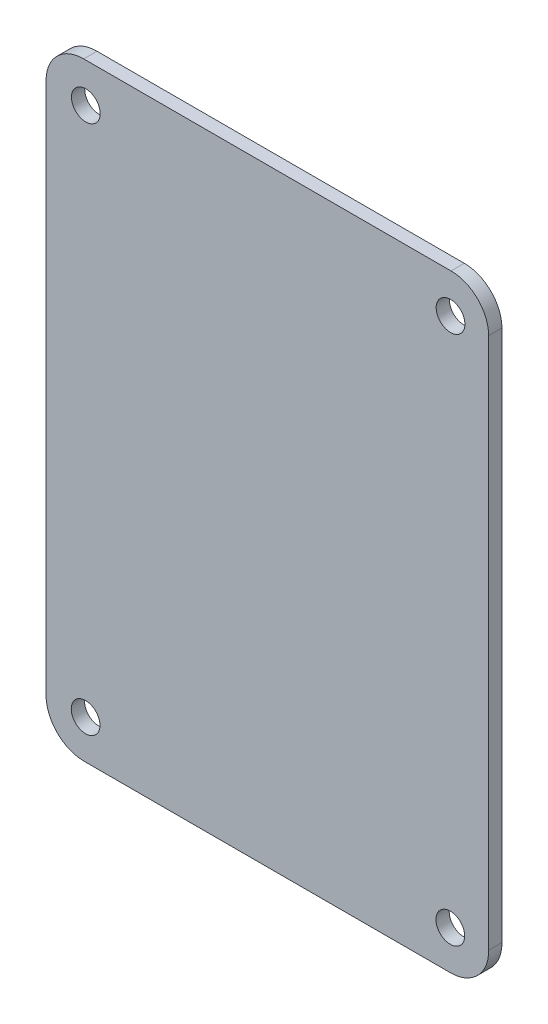
ISO-10303-21;
HEADER;
FILE_DESCRIPTION(('STEP AP214'),'2;1');
FILE_NAME('part.step','',(''),(''),'','','');
FILE_SCHEMA(('AUTOMOTIVE_DESIGN { 1 0 10303 214 1 1 1 1 }'));
ENDSEC;
DATA;
#1=APPLICATION_CONTEXT('core data for automotive mechanical design processes');
#2=APPLICATION_PROTOCOL_DEFINITION('international standard','automotive_design',2000,#1);
#3=PRODUCT_CONTEXT('',#1,'mechanical');
#4=PRODUCT('Part','Part','',(#3));
#5=PRODUCT_RELATED_PRODUCT_CATEGORY('part','',(#4));
#6=PRODUCT_DEFINITION_FORMATION('','',#4);
#7=PRODUCT_DEFINITION_CONTEXT('part definition',#1,'design');
#8=PRODUCT_DEFINITION('design','',#6,#7);
#9=PRODUCT_DEFINITION_SHAPE('','',#8);
#10=(LENGTH_UNIT() NAMED_UNIT(*) SI_UNIT(.MILLI.,.METRE.));
#11=(NAMED_UNIT(*) PLANE_ANGLE_UNIT() SI_UNIT($,.RADIAN.));
#12=(NAMED_UNIT(*) SI_UNIT($,.STERADIAN.) SOLID_ANGLE_UNIT());
#13=UNCERTAINTY_MEASURE_WITH_UNIT(LENGTH_MEASURE(1.E-05),#10,'distance_accuracy_value','');
#14=(GEOMETRIC_REPRESENTATION_CONTEXT(3) GLOBAL_UNCERTAINTY_ASSIGNED_CONTEXT((#13)) GLOBAL_UNIT_ASSIGNED_CONTEXT((#10,
#11,#12)) REPRESENTATION_CONTEXT('',''));
#15=CARTESIAN_POINT('',(0.,0.,0.));
#16=DIRECTION('',(0.,0.,1.));
#17=DIRECTION('',(1.,0.,0.));
#18=AXIS2_PLACEMENT_3D('',#15,#16,#17);
#19=CARTESIAN_POINT('',(-0.08252,-0.02399977056487,-1.2));
#20=DIRECTION('',(0.,0.,1.));
#21=DIRECTION('',(1.,0.,0.));
#22=AXIS2_PLACEMENT_3D('',#19,#20,#21);
#23=PLANE('',#22);
#24=CARTESIAN_POINT('',(16.491277,23.930743,-1.2));
#25=DIRECTION('',(0.,0.,1.));
#26=DIRECTION('',(1.,0.,0.));
#27=AXIS2_PLACEMENT_3D('',#24,#25,#26);
#28=CIRCLE('',#27,1.3);
#29=CARTESIAN_POINT('',(15.191277,23.930743,-1.2));
#30=VERTEX_POINT('',#29);
#31=EDGE_CURVE('E221',#30,#30,#28,.T.);
#32=ORIENTED_EDGE('',*,*,#31,.T.);
#33=EDGE_LOOP('',(#32));
#34=FACE_BOUND('',#33,.T.);
#35=CARTESIAN_POINT('',(-16.508723,23.930743,-1.2));
#36=DIRECTION('',(0.,0.,1.));
#37=DIRECTION('',(1.,0.,0.));
#38=AXIS2_PLACEMENT_3D('',#35,#36,#37);
#39=CIRCLE('',#38,1.3);
#40=CARTESIAN_POINT('',(-17.808723,23.930743,-1.2));
#41=VERTEX_POINT('',#40);
#42=EDGE_CURVE('E149',#41,#41,#39,.T.);
#43=ORIENTED_EDGE('',*,*,#42,.T.);
#44=EDGE_LOOP('',(#43));
#45=FACE_BOUND('',#44,.T.);
#46=CARTESIAN_POINT('',(16.471277,-24.019257,-1.2));
#47=DIRECTION('',(0.,0.,1.));
#48=DIRECTION('',(1.,0.,0.));
#49=AXIS2_PLACEMENT_3D('',#46,#47,#48);
#50=CIRCLE('',#49,1.3);
#51=CARTESIAN_POINT('',(15.171277,-24.019257,-1.2));
#52=VERTEX_POINT('',#51);
#53=EDGE_CURVE('E158',#52,#52,#50,.T.);
#54=ORIENTED_EDGE('',*,*,#53,.T.);
#55=EDGE_LOOP('',(#54));
#56=FACE_BOUND('',#55,.T.);
#57=CARTESIAN_POINT('',(-16.528723,-24.019257,-1.2));
#58=DIRECTION('',(0.,0.,1.));
#59=DIRECTION('',(1.,0.,0.));
#60=AXIS2_PLACEMENT_3D('',#57,#58,#59);
#61=CIRCLE('',#60,1.3);
#62=CARTESIAN_POINT('',(-17.828723,-24.019257,-1.2));
#63=VERTEX_POINT('',#62);
#64=EDGE_CURVE('E20',#63,#63,#61,.T.);
#65=ORIENTED_EDGE('',*,*,#64,.T.);
#66=EDGE_LOOP('',(#65));
#67=FACE_BOUND('',#66,.T.);
#68=DIRECTION('',(0.,-1.,0.));
#69=VECTOR('',#68,1.);
#70=CARTESIAN_POINT('',(-20.10752,24.11146,-1.2));
#71=LINE('',#70,#69);
#72=CARTESIAN_POINT('',(-20.10752,24.11146,-1.2));
#73=VERTEX_POINT('',#72);
#74=CARTESIAN_POINT('',(-20.10752,-24.05137,-1.2));
#75=VERTEX_POINT('',#74);
#76=EDGE_CURVE('E176',#73,#75,#71,.T.);
#77=ORIENTED_EDGE('',*,*,#76,.F.);
#78=CARTESIAN_POINT('',(-16.71963,24.09009,-1.2));
#79=DIRECTION('',(0.,0.,1.));
#80=DIRECTION('',(0.00630763539534392,0.999980106669987,0.));
#81=AXIS2_PLACEMENT_3D('',#78,#79,#80);
#82=CIRCLE('',#81,3.387957397755);
#83=CARTESIAN_POINT('',(-16.69826,27.47798,-1.2));
#84=VERTEX_POINT('',#83);
#85=EDGE_CURVE('E170',#84,#73,#82,.T.);
#86=ORIENTED_EDGE('',*,*,#85,.F.);
#87=DIRECTION('',(-1.,0.,0.));
#88=VECTOR('',#87,1.);
#89=CARTESIAN_POINT('',(16.53322,27.47798,-1.2));
#90=LINE('',#89,#88);
#91=CARTESIAN_POINT('',(16.53322,27.47798,-1.2));
#92=VERTEX_POINT('',#91);
#93=EDGE_CURVE('E164',#92,#84,#90,.T.);
#94=ORIENTED_EDGE('',*,*,#93,.F.);
#95=CARTESIAN_POINT('',(16.55459,24.09009,-1.2));
#96=DIRECTION('',(0.,0.,1.));
#97=DIRECTION('',(0.999980106669987,0.00630763539534692,0.));
#98=AXIS2_PLACEMENT_3D('',#95,#96,#97);
#99=CIRCLE('',#98,3.387957397755);
#100=CARTESIAN_POINT('',(19.94248,24.11146,-1.2));
#101=VERTEX_POINT('',#100);
#102=EDGE_CURVE('E207',#101,#92,#99,.T.);
#103=ORIENTED_EDGE('',*,*,#102,.F.);
#104=DIRECTION('',(0.,1.,0.));
#105=VECTOR('',#104,1.);
#106=CARTESIAN_POINT('',(19.94248,-24.05137,-1.2));
#107=LINE('',#106,#105);
#108=CARTESIAN_POINT('',(19.94248,-24.05137,-1.2));
#109=VERTEX_POINT('',#108);
#110=EDGE_CURVE('E185',#109,#101,#107,.T.);
#111=ORIENTED_EDGE('',*,*,#110,.F.);
#112=CARTESIAN_POINT('',(16.49193,-24.09266,-1.2));
#113=DIRECTION('',(0.,0.,1.));
#114=DIRECTION('',(0.0119653516561059,-0.999928412617496,0.));
#115=AXIS2_PLACEMENT_3D('',#112,#113,#114);
#116=CIRCLE('',#115,3.450797033527);
#117=CARTESIAN_POINT('',(16.53322,-27.54321,-1.2));
#118=VERTEX_POINT('',#117);
#119=EDGE_CURVE('E240',#118,#109,#116,.T.);
#120=ORIENTED_EDGE('',*,*,#119,.F.);
#121=DIRECTION('',(1.,0.,0.));
#122=VECTOR('',#121,1.);
#123=CARTESIAN_POINT('',(-16.69826,-27.54321,-1.2));
#124=LINE('',#123,#122);
#125=CARTESIAN_POINT('',(-16.69826,-27.54321,-1.2));
#126=VERTEX_POINT('',#125);
#127=EDGE_CURVE('E112',#126,#118,#124,.T.);
#128=ORIENTED_EDGE('',*,*,#127,.F.);
#129=CARTESIAN_POINT('',(-16.65697,-24.09266,-1.2));
#130=DIRECTION('',(0.,0.,1.));
#131=DIRECTION('',(-0.999928412617496,0.0119653516561159,0.));
#132=AXIS2_PLACEMENT_3D('',#129,#130,#131);
#133=CIRCLE('',#132,3.450797033527);
#134=EDGE_CURVE('E169',#75,#126,#133,.T.);
#135=ORIENTED_EDGE('',*,*,#134,.F.);
#136=EDGE_LOOP('',(#77,#86,#94,#103,#111,#120,#128,#135));
#137=FACE_BOUND('',#136,.T.);
#138=ADVANCED_FACE('F16',(#34,#45,#56,#67,#137),#23,.F.);
#139=CARTESIAN_POINT('',(-0.08252,-0.02399977056487,0.));
#140=DIRECTION('',(0.,0.,1.));
#141=DIRECTION('',(1.,0.,0.));
#142=AXIS2_PLACEMENT_3D('',#139,#140,#141);
#143=PLANE('',#142);
#144=CARTESIAN_POINT('',(16.491277,23.930743,0.));
#145=DIRECTION('',(0.,0.,1.));
#146=DIRECTION('',(1.,0.,0.));
#147=AXIS2_PLACEMENT_3D('',#144,#145,#146);
#148=CIRCLE('',#147,1.3);
#149=CARTESIAN_POINT('',(15.191277,23.930743,0.));
#150=VERTEX_POINT('',#149);
#151=EDGE_CURVE('E11',#150,#150,#148,.T.);
#152=ORIENTED_EDGE('',*,*,#151,.F.);
#153=EDGE_LOOP('',(#152));
#154=FACE_BOUND('',#153,.T.);
#155=CARTESIAN_POINT('',(-16.508723,23.930743,0.));
#156=DIRECTION('',(0.,0.,1.));
#157=DIRECTION('',(1.,0.,0.));
#158=AXIS2_PLACEMENT_3D('',#155,#156,#157);
#159=CIRCLE('',#158,1.3);
#160=CARTESIAN_POINT('',(-17.808723,23.930743,0.));
#161=VERTEX_POINT('',#160);
#162=EDGE_CURVE('E218',#161,#161,#159,.T.);
#163=ORIENTED_EDGE('',*,*,#162,.F.);
#164=EDGE_LOOP('',(#163));
#165=FACE_BOUND('',#164,.T.);
#166=CARTESIAN_POINT('',(16.471277,-24.019257,0.));
#167=DIRECTION('',(0.,0.,1.));
#168=DIRECTION('',(1.,0.,0.));
#169=AXIS2_PLACEMENT_3D('',#166,#167,#168);
#170=CIRCLE('',#169,1.3);
#171=CARTESIAN_POINT('',(15.171277,-24.019257,0.));
#172=VERTEX_POINT('',#171);
#173=EDGE_CURVE('E145',#172,#172,#170,.T.);
#174=ORIENTED_EDGE('',*,*,#173,.F.);
#175=EDGE_LOOP('',(#174));
#176=FACE_BOUND('',#175,.T.);
#177=CARTESIAN_POINT('',(-16.528723,-24.019257,0.));
#178=DIRECTION('',(0.,0.,1.));
#179=DIRECTION('',(1.,0.,0.));
#180=AXIS2_PLACEMENT_3D('',#177,#178,#179);
#181=CIRCLE('',#180,1.3);
#182=CARTESIAN_POINT('',(-17.828723,-24.019257,0.));
#183=VERTEX_POINT('',#182);
#184=EDGE_CURVE('E181',#183,#183,#181,.T.);
#185=ORIENTED_EDGE('',*,*,#184,.F.);
#186=EDGE_LOOP('',(#185));
#187=FACE_BOUND('',#186,.T.);
#188=DIRECTION('',(0.,-1.,0.));
#189=VECTOR('',#188,1.);
#190=CARTESIAN_POINT('',(-20.10752,24.11146,0.));
#191=LINE('',#190,#189);
#192=CARTESIAN_POINT('',(-20.10752,24.11146,0.));
#193=VERTEX_POINT('',#192);
#194=CARTESIAN_POINT('',(-20.10752,-24.05137,0.));
#195=VERTEX_POINT('',#194);
#196=EDGE_CURVE('E175',#193,#195,#191,.T.);
#197=ORIENTED_EDGE('',*,*,#196,.T.);
#198=CARTESIAN_POINT('',(-16.65697,-24.09266,0.));
#199=DIRECTION('',(0.,0.,1.));
#200=DIRECTION('',(-0.999928412617496,0.0119653516561159,0.));
#201=AXIS2_PLACEMENT_3D('',#198,#199,#200);
#202=CIRCLE('',#201,3.450797033527);
#203=CARTESIAN_POINT('',(-16.69826,-27.54321,0.));
#204=VERTEX_POINT('',#203);
#205=EDGE_CURVE('E165',#195,#204,#202,.T.);
#206=ORIENTED_EDGE('',*,*,#205,.T.);
#207=DIRECTION('',(1.,0.,0.));
#208=VECTOR('',#207,1.);
#209=CARTESIAN_POINT('',(-16.69826,-27.54321,0.));
#210=LINE('',#209,#208);
#211=CARTESIAN_POINT('',(16.53322,-27.54321,0.));
#212=VERTEX_POINT('',#211);
#213=EDGE_CURVE('E101',#204,#212,#210,.T.);
#214=ORIENTED_EDGE('',*,*,#213,.T.);
#215=CARTESIAN_POINT('',(16.49193,-24.09266,0.));
#216=DIRECTION('',(0.,0.,1.));
#217=DIRECTION('',(0.0119653516561059,-0.999928412617496,0.));
#218=AXIS2_PLACEMENT_3D('',#215,#216,#217);
#219=CIRCLE('',#218,3.450797033527);
#220=CARTESIAN_POINT('',(19.94248,-24.05137,0.));
#221=VERTEX_POINT('',#220);
#222=EDGE_CURVE('E189',#212,#221,#219,.T.);
#223=ORIENTED_EDGE('',*,*,#222,.T.);
#224=DIRECTION('',(0.,1.,0.));
#225=VECTOR('',#224,1.);
#226=CARTESIAN_POINT('',(19.94248,-24.05137,0.));
#227=LINE('',#226,#225);
#228=CARTESIAN_POINT('',(19.94248,24.11146,0.));
#229=VERTEX_POINT('',#228);
#230=EDGE_CURVE('E188',#221,#229,#227,.T.);
#231=ORIENTED_EDGE('',*,*,#230,.T.);
#232=CARTESIAN_POINT('',(16.55459,24.09009,0.));
#233=DIRECTION('',(0.,0.,1.));
#234=DIRECTION('',(0.999980106669987,0.00630763539534692,0.));
#235=AXIS2_PLACEMENT_3D('',#232,#233,#234);
#236=CIRCLE('',#235,3.387957397755);
#237=CARTESIAN_POINT('',(16.53322,27.47798,0.));
#238=VERTEX_POINT('',#237);
#239=EDGE_CURVE('E210',#229,#238,#236,.T.);
#240=ORIENTED_EDGE('',*,*,#239,.T.);
#241=DIRECTION('',(-1.,0.,0.));
#242=VECTOR('',#241,1.);
#243=CARTESIAN_POINT('',(16.53322,27.47798,0.));
#244=LINE('',#243,#242);
#245=CARTESIAN_POINT('',(-16.69826,27.47798,0.));
#246=VERTEX_POINT('',#245);
#247=EDGE_CURVE('E196',#238,#246,#244,.T.);
#248=ORIENTED_EDGE('',*,*,#247,.T.);
#249=CARTESIAN_POINT('',(-16.71963,24.09009,0.));
#250=DIRECTION('',(0.,0.,1.));
#251=DIRECTION('',(0.00630763539534392,0.999980106669987,0.));
#252=AXIS2_PLACEMENT_3D('',#249,#250,#251);
#253=CIRCLE('',#252,3.387957397755);
#254=EDGE_CURVE('E166',#246,#193,#253,.T.);
#255=ORIENTED_EDGE('',*,*,#254,.T.);
#256=EDGE_LOOP('',(#197,#206,#214,#223,#231,#240,#248,#255));
#257=FACE_BOUND('',#256,.T.);
#258=ADVANCED_FACE('F269',(#154,#165,#176,#187,#257),#143,.T.);
#259=CARTESIAN_POINT('',(16.491277,23.930743,0.));
#260=DIRECTION('',(0.,0.,1.));
#261=DIRECTION('',(1.,0.,0.));
#262=AXIS2_PLACEMENT_3D('',#259,#260,#261);
#263=CYLINDRICAL_SURFACE('',#262,1.3);
#264=ORIENTED_EDGE('',*,*,#31,.F.);
#265=DIRECTION('',(0.,0.,1.));
#266=VECTOR('',#265,1.);
#267=CARTESIAN_POINT('',(15.191277,23.930743,0.));
#268=LINE('',#267,#266);
#269=EDGE_CURVE('E27',#30,#150,#268,.T.);
#270=ORIENTED_EDGE('',*,*,#269,.T.);
#271=ORIENTED_EDGE('',*,*,#151,.T.);
#272=ORIENTED_EDGE('',*,*,#269,.F.);
#273=EDGE_LOOP('',(#264,#270,#271,#272));
#274=FACE_BOUND('',#273,.T.);
#275=ADVANCED_FACE('F345',(#274),#263,.F.);
#276=CARTESIAN_POINT('',(-16.508723,23.930743,0.));
#277=DIRECTION('',(0.,0.,1.));
#278=DIRECTION('',(1.,0.,0.));
#279=AXIS2_PLACEMENT_3D('',#276,#277,#278);
#280=CYLINDRICAL_SURFACE('',#279,1.3);
#281=ORIENTED_EDGE('',*,*,#42,.F.);
#282=DIRECTION('',(0.,0.,1.));
#283=VECTOR('',#282,1.);
#284=CARTESIAN_POINT('',(-17.808723,23.930743,0.));
#285=LINE('',#284,#283);
#286=EDGE_CURVE('E155',#41,#161,#285,.T.);
#287=ORIENTED_EDGE('',*,*,#286,.T.);
#288=ORIENTED_EDGE('',*,*,#162,.T.);
#289=ORIENTED_EDGE('',*,*,#286,.F.);
#290=EDGE_LOOP('',(#281,#287,#288,#289));
#291=FACE_BOUND('',#290,.T.);
#292=ADVANCED_FACE('F18',(#291),#280,.F.);
#293=CARTESIAN_POINT('',(16.471277,-24.019257,0.));
#294=DIRECTION('',(0.,0.,1.));
#295=DIRECTION('',(1.,0.,0.));
#296=AXIS2_PLACEMENT_3D('',#293,#294,#295);
#297=CYLINDRICAL_SURFACE('',#296,1.3);
#298=ORIENTED_EDGE('',*,*,#53,.F.);
#299=DIRECTION('',(0.,0.,1.));
#300=VECTOR('',#299,1.);
#301=CARTESIAN_POINT('',(15.171277,-24.019257,0.));
#302=LINE('',#301,#300);
#303=EDGE_CURVE('E141',#52,#172,#302,.T.);
#304=ORIENTED_EDGE('',*,*,#303,.T.);
#305=ORIENTED_EDGE('',*,*,#173,.T.);
#306=ORIENTED_EDGE('',*,*,#303,.F.);
#307=EDGE_LOOP('',(#298,#304,#305,#306));
#308=FACE_BOUND('',#307,.T.);
#309=ADVANCED_FACE('F146',(#308),#297,.F.);
#310=CARTESIAN_POINT('',(-16.528723,-24.019257,0.));
#311=DIRECTION('',(0.,0.,1.));
#312=DIRECTION('',(1.,0.,0.));
#313=AXIS2_PLACEMENT_3D('',#310,#311,#312);
#314=CYLINDRICAL_SURFACE('',#313,1.3);
#315=ORIENTED_EDGE('',*,*,#64,.F.);
#316=DIRECTION('',(0.,0.,1.));
#317=VECTOR('',#316,1.);
#318=CARTESIAN_POINT('',(-17.828723,-24.019257,0.));
#319=LINE('',#318,#317);
#320=EDGE_CURVE('E184',#63,#183,#319,.T.);
#321=ORIENTED_EDGE('',*,*,#320,.T.);
#322=ORIENTED_EDGE('',*,*,#184,.T.);
#323=ORIENTED_EDGE('',*,*,#320,.F.);
#324=EDGE_LOOP('',(#315,#321,#322,#323));
#325=FACE_BOUND('',#324,.T.);
#326=ADVANCED_FACE('F359',(#325),#314,.F.);
#327=CARTESIAN_POINT('',(19.94248,-24.05137,0.));
#328=DIRECTION('',(1.,0.,0.));
#329=DIRECTION('',(0.,1.,0.));
#330=AXIS2_PLACEMENT_3D('',#327,#328,#329);
#331=PLANE('',#330);
#332=DIRECTION('',(0.,0.,-1.));
#333=VECTOR('',#332,1.);
#334=CARTESIAN_POINT('',(19.94248,-24.05137,0.));
#335=LINE('',#334,#333);
#336=EDGE_CURVE('E193',#221,#109,#335,.T.);
#337=ORIENTED_EDGE('',*,*,#336,.T.);
#338=ORIENTED_EDGE('',*,*,#110,.T.);
#339=DIRECTION('',(0.,0.,-1.));
#340=VECTOR('',#339,1.);
#341=CARTESIAN_POINT('',(19.94248,24.11146,0.));
#342=LINE('',#341,#340);
#343=EDGE_CURVE('E211',#229,#101,#342,.T.);
#344=ORIENTED_EDGE('',*,*,#343,.F.);
#345=ORIENTED_EDGE('',*,*,#230,.F.);
#346=EDGE_LOOP('',(#337,#338,#344,#345));
#347=FACE_BOUND('',#346,.T.);
#348=ADVANCED_FACE('F297',(#347),#331,.T.);
#349=CARTESIAN_POINT('',(16.49193,-24.09266,0.));
#350=DIRECTION('',(0.,0.,1.));
#351=DIRECTION('',(0.0119653516561059,-0.999928412617496,0.));
#352=AXIS2_PLACEMENT_3D('',#349,#350,#351);
#353=CYLINDRICAL_SURFACE('',#352,3.450797033527);
#354=DIRECTION('',(0.,0.,-1.));
#355=VECTOR('',#354,1.);
#356=CARTESIAN_POINT('',(16.53322,-27.54321,0.));
#357=LINE('',#356,#355);
#358=EDGE_CURVE('E212',#212,#118,#357,.T.);
#359=ORIENTED_EDGE('',*,*,#358,.T.);
#360=ORIENTED_EDGE('',*,*,#119,.T.);
#361=ORIENTED_EDGE('',*,*,#336,.F.);
#362=ORIENTED_EDGE('',*,*,#222,.F.);
#363=EDGE_LOOP('',(#359,#360,#361,#362));
#364=FACE_BOUND('',#363,.T.);
#365=ADVANCED_FACE('F300',(#364),#353,.T.);
#366=CARTESIAN_POINT('',(16.55459,24.09009,0.));
#367=DIRECTION('',(0.,0.,1.));
#368=DIRECTION('',(0.999980106669987,0.00630763539534692,0.));
#369=AXIS2_PLACEMENT_3D('',#366,#367,#368);
#370=CYLINDRICAL_SURFACE('',#369,3.387957397755);
#371=ORIENTED_EDGE('',*,*,#343,.T.);
#372=ORIENTED_EDGE('',*,*,#102,.T.);
#373=DIRECTION('',(0.,0.,-1.));
#374=VECTOR('',#373,1.);
#375=CARTESIAN_POINT('',(16.53322,27.47798,0.));
#376=LINE('',#375,#374);
#377=EDGE_CURVE('E161',#238,#92,#376,.T.);
#378=ORIENTED_EDGE('',*,*,#377,.F.);
#379=ORIENTED_EDGE('',*,*,#239,.F.);
#380=EDGE_LOOP('',(#371,#372,#378,#379));
#381=FACE_BOUND('',#380,.T.);
#382=ADVANCED_FACE('F295',(#381),#370,.T.);
#383=CARTESIAN_POINT('',(-16.69826,-27.54321,0.));
#384=DIRECTION('',(0.,-1.,0.));
#385=DIRECTION('',(0.,0.,-1.));
#386=AXIS2_PLACEMENT_3D('',#383,#384,#385);
#387=PLANE('',#386);
#388=DIRECTION('',(0.,0.,-1.));
#389=VECTOR('',#388,1.);
#390=CARTESIAN_POINT('',(-16.69826,-27.54321,0.));
#391=LINE('',#390,#389);
#392=EDGE_CURVE('E203',#204,#126,#391,.T.);
#393=ORIENTED_EDGE('',*,*,#392,.T.);
#394=ORIENTED_EDGE('',*,*,#127,.T.);
#395=ORIENTED_EDGE('',*,*,#358,.F.);
#396=ORIENTED_EDGE('',*,*,#213,.F.);
#397=EDGE_LOOP('',(#393,#394,#395,#396));
#398=FACE_BOUND('',#397,.T.);
#399=ADVANCED_FACE('F339',(#398),#387,.T.);
#400=CARTESIAN_POINT('',(16.53322,27.47798,0.));
#401=DIRECTION('',(0.,1.,0.));
#402=DIRECTION('',(1.,0.,0.));
#403=AXIS2_PLACEMENT_3D('',#400,#401,#402);
#404=PLANE('',#403);
#405=ORIENTED_EDGE('',*,*,#377,.T.);
#406=ORIENTED_EDGE('',*,*,#93,.T.);
#407=DIRECTION('',(0.,0.,-1.));
#408=VECTOR('',#407,1.);
#409=CARTESIAN_POINT('',(-16.69826,27.47798,0.));
#410=LINE('',#409,#408);
#411=EDGE_CURVE('E199',#246,#84,#410,.T.);
#412=ORIENTED_EDGE('',*,*,#411,.F.);
#413=ORIENTED_EDGE('',*,*,#247,.F.);
#414=EDGE_LOOP('',(#405,#406,#412,#413));
#415=FACE_BOUND('',#414,.T.);
#416=ADVANCED_FACE('F289',(#415),#404,.T.);
#417=CARTESIAN_POINT('',(-16.65697,-24.09266,0.));
#418=DIRECTION('',(0.,0.,1.));
#419=DIRECTION('',(-0.999928412617496,0.0119653516561159,0.));
#420=AXIS2_PLACEMENT_3D('',#417,#418,#419);
#421=CYLINDRICAL_SURFACE('',#420,3.450797033527);
#422=DIRECTION('',(0.,0.,-1.));
#423=VECTOR('',#422,1.);
#424=CARTESIAN_POINT('',(-20.10752,-24.05137,0.));
#425=LINE('',#424,#423);
#426=EDGE_CURVE('E171',#195,#75,#425,.T.);
#427=ORIENTED_EDGE('',*,*,#426,.T.);
#428=ORIENTED_EDGE('',*,*,#134,.T.);
#429=ORIENTED_EDGE('',*,*,#392,.F.);
#430=ORIENTED_EDGE('',*,*,#205,.F.);
#431=EDGE_LOOP('',(#427,#428,#429,#430));
#432=FACE_BOUND('',#431,.T.);
#433=ADVANCED_FACE('F342',(#432),#421,.T.);
#434=CARTESIAN_POINT('',(-16.71963,24.09009,0.));
#435=DIRECTION('',(0.,0.,1.));
#436=DIRECTION('',(0.00630763539534392,0.999980106669987,0.));
#437=AXIS2_PLACEMENT_3D('',#434,#435,#436);
#438=CYLINDRICAL_SURFACE('',#437,3.387957397755);
#439=ORIENTED_EDGE('',*,*,#411,.T.);
#440=ORIENTED_EDGE('',*,*,#85,.T.);
#441=DIRECTION('',(0.,0.,-1.));
#442=VECTOR('',#441,1.);
#443=CARTESIAN_POINT('',(-20.10752,24.11146,0.));
#444=LINE('',#443,#442);
#445=EDGE_CURVE('E177',#193,#73,#444,.T.);
#446=ORIENTED_EDGE('',*,*,#445,.F.);
#447=ORIENTED_EDGE('',*,*,#254,.F.);
#448=EDGE_LOOP('',(#439,#440,#446,#447));
#449=FACE_BOUND('',#448,.T.);
#450=ADVANCED_FACE('F285',(#449),#438,.T.);
#451=CARTESIAN_POINT('',(-20.10752,24.11146,0.));
#452=DIRECTION('',(-1.,0.,0.));
#453=DIRECTION('',(0.,0.,1.));
#454=AXIS2_PLACEMENT_3D('',#451,#452,#453);
#455=PLANE('',#454);
#456=ORIENTED_EDGE('',*,*,#445,.T.);
#457=ORIENTED_EDGE('',*,*,#76,.T.);
#458=ORIENTED_EDGE('',*,*,#426,.F.);
#459=ORIENTED_EDGE('',*,*,#196,.F.);
#460=EDGE_LOOP('',(#456,#457,#458,#459));
#461=FACE_BOUND('',#460,.T.);
#462=ADVANCED_FACE('F282',(#461),#455,.T.);
#463=CLOSED_SHELL('',(#138,#258,#275,#292,#309,#326,#348,#365,#382,#399,#416,#433,#450,#462));
#464=MANIFOLD_SOLID_BREP('B1',#463);
#465=ADVANCED_BREP_SHAPE_REPRESENTATION('',(#18,#464),#14);
#466=SHAPE_DEFINITION_REPRESENTATION(#9,#465);
ENDSEC;
END-ISO-10303-21;
